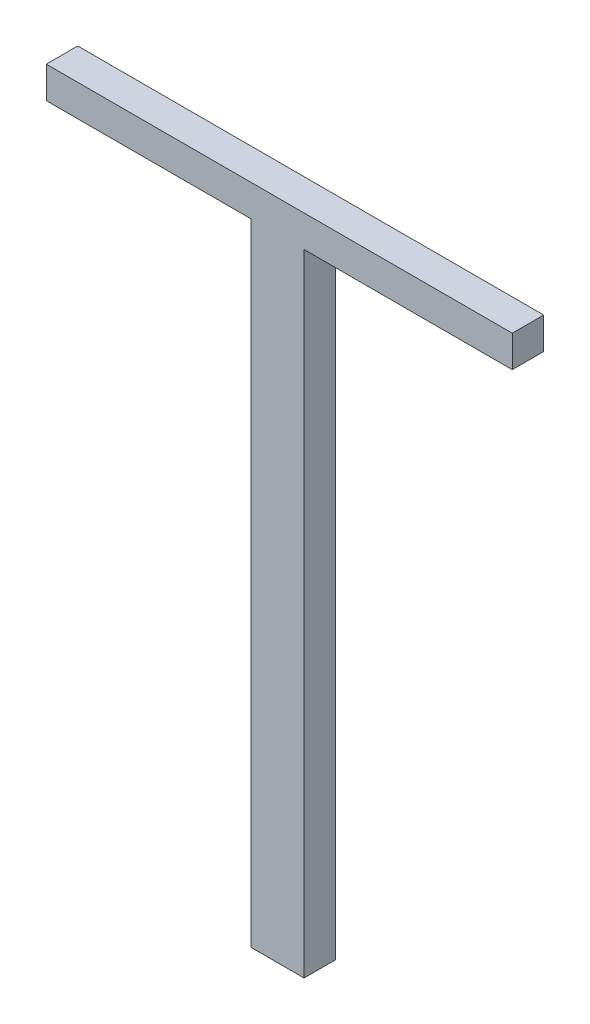
ISO-10303-21;
HEADER;
FILE_DESCRIPTION(('STEP AP214'),'2;1');
FILE_NAME('part.step','',(''),(''),'','','');
FILE_SCHEMA(('AUTOMOTIVE_DESIGN { 1 0 10303 214 1 1 1 1 }'));
ENDSEC;
DATA;
#1=APPLICATION_CONTEXT('core data for automotive mechanical design processes');
#2=APPLICATION_PROTOCOL_DEFINITION('international standard','automotive_design',2000,#1);
#3=PRODUCT_CONTEXT('',#1,'mechanical');
#4=PRODUCT('Part','Part','',(#3));
#5=PRODUCT_RELATED_PRODUCT_CATEGORY('part','',(#4));
#6=PRODUCT_DEFINITION_FORMATION('','',#4);
#7=PRODUCT_DEFINITION_CONTEXT('part definition',#1,'design');
#8=PRODUCT_DEFINITION('design','',#6,#7);
#9=PRODUCT_DEFINITION_SHAPE('','',#8);
#10=(LENGTH_UNIT() NAMED_UNIT(*) SI_UNIT(.MILLI.,.METRE.));
#11=(NAMED_UNIT(*) PLANE_ANGLE_UNIT() SI_UNIT($,.RADIAN.));
#12=(NAMED_UNIT(*) SI_UNIT($,.STERADIAN.) SOLID_ANGLE_UNIT());
#13=UNCERTAINTY_MEASURE_WITH_UNIT(LENGTH_MEASURE(1.E-05),#10,'distance_accuracy_value','');
#14=(GEOMETRIC_REPRESENTATION_CONTEXT(3) GLOBAL_UNCERTAINTY_ASSIGNED_CONTEXT((#13)) GLOBAL_UNIT_ASSIGNED_CONTEXT((#10,
#11,#12)) REPRESENTATION_CONTEXT('',''));
#15=CARTESIAN_POINT('',(0.,0.,0.));
#16=DIRECTION('',(0.,0.,1.));
#17=DIRECTION('',(1.,0.,0.));
#18=AXIS2_PLACEMENT_3D('',#15,#16,#17);
#19=CARTESIAN_POINT('',(58.0187075187695,-167.496729448971,50.));
#20=DIRECTION('',(0.,1.,0.));
#21=DIRECTION('',(0.,0.,1.));
#22=AXIS2_PLACEMENT_3D('',#19,#20,#21);
#23=PLANE('',#22);
#24=DIRECTION('',(1.,0.,0.));
#25=VECTOR('',#24,1.);
#26=CARTESIAN_POINT('',(58.0187075187695,-167.496729448971,0.));
#27=LINE('',#26,#25);
#28=CARTESIAN_POINT('',(-26.0359499678474,-167.496729448971,0.));
#29=VERTEX_POINT('',#28);
#30=CARTESIAN_POINT('',(58.0187075187695,-167.496729448971,0.));
#31=VERTEX_POINT('',#30);
#32=EDGE_CURVE('E131',#29,#31,#27,.T.);
#33=ORIENTED_EDGE('',*,*,#32,.T.);
#34=DIRECTION('',(0.,0.,-1.));
#35=VECTOR('',#34,1.);
#36=CARTESIAN_POINT('',(58.0187075187695,-167.496729448971,50.));
#37=LINE('',#36,#35);
#38=CARTESIAN_POINT('',(58.0187075187695,-167.496729448971,50.));
#39=VERTEX_POINT('',#38);
#40=EDGE_CURVE('E11',#39,#31,#37,.T.);
#41=ORIENTED_EDGE('',*,*,#40,.F.);
#42=DIRECTION('',(1.,0.,0.));
#43=VECTOR('',#42,1.);
#44=CARTESIAN_POINT('',(58.0187075187695,-167.496729448971,50.));
#45=LINE('',#44,#43);
#46=CARTESIAN_POINT('',(-26.0359499678474,-167.496729448971,50.));
#47=VERTEX_POINT('',#46);
#48=EDGE_CURVE('E145',#47,#39,#45,.T.);
#49=ORIENTED_EDGE('',*,*,#48,.F.);
#50=DIRECTION('',(0.,0.,-1.));
#51=VECTOR('',#50,1.);
#52=CARTESIAN_POINT('',(-26.0359499678474,-167.496729448971,50.));
#53=LINE('',#52,#51);
#54=EDGE_CURVE('E127',#47,#29,#53,.T.);
#55=ORIENTED_EDGE('',*,*,#54,.T.);
#56=EDGE_LOOP('',(#33,#41,#49,#55));
#57=FACE_BOUND('',#56,.T.);
#58=ADVANCED_FACE('F35',(#57),#23,.F.);
#59=CARTESIAN_POINT('',(58.0187075187695,835.72491726563,50.));
#60=DIRECTION('',(-1.,0.,0.));
#61=DIRECTION('',(0.,0.,1.));
#62=AXIS2_PLACEMENT_3D('',#59,#60,#61);
#63=PLANE('',#62);
#64=DIRECTION('',(0.,1.,0.));
#65=VECTOR('',#64,1.);
#66=CARTESIAN_POINT('',(58.0187075187695,835.72491726563,0.));
#67=LINE('',#66,#65);
#68=CARTESIAN_POINT('',(58.0187075187695,835.72491726563,0.));
#69=VERTEX_POINT('',#68);
#70=EDGE_CURVE('E134',#31,#69,#67,.T.);
#71=ORIENTED_EDGE('',*,*,#70,.T.);
#72=DIRECTION('',(0.,0.,-1.));
#73=VECTOR('',#72,1.);
#74=CARTESIAN_POINT('',(58.0187075187695,835.72491726563,50.));
#75=LINE('',#74,#73);
#76=CARTESIAN_POINT('',(58.0187075187695,835.72491726563,50.));
#77=VERTEX_POINT('',#76);
#78=EDGE_CURVE('E43',#77,#69,#75,.T.);
#79=ORIENTED_EDGE('',*,*,#78,.F.);
#80=DIRECTION('',(0.,1.,0.));
#81=VECTOR('',#80,1.);
#82=CARTESIAN_POINT('',(58.0187075187695,835.72491726563,50.));
#83=LINE('',#82,#81);
#84=EDGE_CURVE('E94',#39,#77,#83,.T.);
#85=ORIENTED_EDGE('',*,*,#84,.F.);
#86=ORIENTED_EDGE('',*,*,#40,.T.);
#87=EDGE_LOOP('',(#71,#79,#85,#86));
#88=FACE_BOUND('',#87,.T.);
#89=ADVANCED_FACE('F180',(#88),#63,.F.);
#90=CARTESIAN_POINT('',(389.114652518314,835.72491726563,50.));
#91=DIRECTION('',(0.,1.,0.));
#92=DIRECTION('',(0.,0.,1.));
#93=AXIS2_PLACEMENT_3D('',#90,#91,#92);
#94=PLANE('',#93);
#95=DIRECTION('',(1.,0.,0.));
#96=VECTOR('',#95,1.);
#97=CARTESIAN_POINT('',(389.114652518314,835.72491726563,0.));
#98=LINE('',#97,#96);
#99=CARTESIAN_POINT('',(389.114652518314,835.72491726563,0.));
#100=VERTEX_POINT('',#99);
#101=EDGE_CURVE('E136',#69,#100,#98,.T.);
#102=ORIENTED_EDGE('',*,*,#101,.T.);
#103=DIRECTION('',(0.,0.,-1.));
#104=VECTOR('',#103,1.);
#105=CARTESIAN_POINT('',(389.114652518314,835.72491726563,50.));
#106=LINE('',#105,#104);
#107=CARTESIAN_POINT('',(389.114652518314,835.72491726563,50.));
#108=VERTEX_POINT('',#107);
#109=EDGE_CURVE('E152',#108,#100,#106,.T.);
#110=ORIENTED_EDGE('',*,*,#109,.F.);
#111=DIRECTION('',(1.,0.,0.));
#112=VECTOR('',#111,1.);
#113=CARTESIAN_POINT('',(389.114652518314,835.72491726563,50.));
#114=LINE('',#113,#112);
#115=EDGE_CURVE('E160',#77,#108,#114,.T.);
#116=ORIENTED_EDGE('',*,*,#115,.F.);
#117=ORIENTED_EDGE('',*,*,#78,.T.);
#118=EDGE_LOOP('',(#102,#110,#116,#117));
#119=FACE_BOUND('',#118,.T.);
#120=ADVANCED_FACE('F158',(#119),#94,.F.);
#121=CARTESIAN_POINT('',(389.114652518314,886.007674206316,50.));
#122=DIRECTION('',(-1.,0.,0.));
#123=DIRECTION('',(0.,0.,1.));
#124=AXIS2_PLACEMENT_3D('',#121,#122,#123);
#125=PLANE('',#124);
#126=DIRECTION('',(0.,1.,0.));
#127=VECTOR('',#126,1.);
#128=CARTESIAN_POINT('',(389.114652518314,886.007674206316,0.));
#129=LINE('',#128,#127);
#130=CARTESIAN_POINT('',(389.114652518314,886.007674206316,0.));
#131=VERTEX_POINT('',#130);
#132=EDGE_CURVE('E138',#100,#131,#129,.T.);
#133=ORIENTED_EDGE('',*,*,#132,.T.);
#134=DIRECTION('',(0.,0.,-1.));
#135=VECTOR('',#134,1.);
#136=CARTESIAN_POINT('',(389.114652518314,886.007674206316,50.));
#137=LINE('',#136,#135);
#138=CARTESIAN_POINT('',(389.114652518314,886.007674206316,50.));
#139=VERTEX_POINT('',#138);
#140=EDGE_CURVE('E149',#139,#131,#137,.T.);
#141=ORIENTED_EDGE('',*,*,#140,.F.);
#142=DIRECTION('',(0.,1.,0.));
#143=VECTOR('',#142,1.);
#144=CARTESIAN_POINT('',(389.114652518314,886.007674206316,50.));
#145=LINE('',#144,#143);
#146=EDGE_CURVE('E172',#108,#139,#145,.T.);
#147=ORIENTED_EDGE('',*,*,#146,.F.);
#148=ORIENTED_EDGE('',*,*,#109,.T.);
#149=EDGE_LOOP('',(#133,#141,#147,#148));
#150=FACE_BOUND('',#149,.T.);
#151=ADVANCED_FACE('F168',(#150),#125,.F.);
#152=CARTESIAN_POINT('',(-351.793024616114,886.007674206316,50.));
#153=DIRECTION('',(0.,-1.,0.));
#154=DIRECTION('',(0.,0.,-1.));
#155=AXIS2_PLACEMENT_3D('',#152,#153,#154);
#156=PLANE('',#155);
#157=DIRECTION('',(-1.,0.,0.));
#158=VECTOR('',#157,1.);
#159=CARTESIAN_POINT('',(-351.793024616114,886.007674206316,0.));
#160=LINE('',#159,#158);
#161=CARTESIAN_POINT('',(-351.793024616114,886.007674206316,0.));
#162=VERTEX_POINT('',#161);
#163=EDGE_CURVE('E140',#131,#162,#160,.T.);
#164=ORIENTED_EDGE('',*,*,#163,.T.);
#165=DIRECTION('',(0.,0.,-1.));
#166=VECTOR('',#165,1.);
#167=CARTESIAN_POINT('',(-351.793024616114,886.007674206316,50.));
#168=LINE('',#167,#166);
#169=CARTESIAN_POINT('',(-351.793024616114,886.007674206316,50.));
#170=VERTEX_POINT('',#169);
#171=EDGE_CURVE('E122',#170,#162,#168,.T.);
#172=ORIENTED_EDGE('',*,*,#171,.F.);
#173=DIRECTION('',(-1.,0.,0.));
#174=VECTOR('',#173,1.);
#175=CARTESIAN_POINT('',(-351.793024616114,886.007674206316,50.));
#176=LINE('',#175,#174);
#177=EDGE_CURVE('E113',#139,#170,#176,.T.);
#178=ORIENTED_EDGE('',*,*,#177,.F.);
#179=ORIENTED_EDGE('',*,*,#140,.T.);
#180=EDGE_LOOP('',(#164,#172,#178,#179));
#181=FACE_BOUND('',#180,.T.);
#182=ADVANCED_FACE('F171',(#181),#156,.F.);
#183=CARTESIAN_POINT('',(-351.793024616114,835.72491726563,50.));
#184=DIRECTION('',(1.,0.,0.));
#185=DIRECTION('',(0.,0.,-1.));
#186=AXIS2_PLACEMENT_3D('',#183,#184,#185);
#187=PLANE('',#186);
#188=DIRECTION('',(0.,-1.,0.));
#189=VECTOR('',#188,1.);
#190=CARTESIAN_POINT('',(-351.793024616114,835.72491726563,0.));
#191=LINE('',#190,#189);
#192=CARTESIAN_POINT('',(-351.793024616114,835.72491726563,0.));
#193=VERTEX_POINT('',#192);
#194=EDGE_CURVE('E121',#162,#193,#191,.T.);
#195=ORIENTED_EDGE('',*,*,#194,.T.);
#196=DIRECTION('',(0.,0.,-1.));
#197=VECTOR('',#196,1.);
#198=CARTESIAN_POINT('',(-351.793024616114,835.72491726563,50.));
#199=LINE('',#198,#197);
#200=CARTESIAN_POINT('',(-351.793024616114,835.72491726563,50.));
#201=VERTEX_POINT('',#200);
#202=EDGE_CURVE('E118',#201,#193,#199,.T.);
#203=ORIENTED_EDGE('',*,*,#202,.F.);
#204=DIRECTION('',(0.,-1.,0.));
#205=VECTOR('',#204,1.);
#206=CARTESIAN_POINT('',(-351.793024616114,835.72491726563,50.));
#207=LINE('',#206,#205);
#208=EDGE_CURVE('E107',#170,#201,#207,.T.);
#209=ORIENTED_EDGE('',*,*,#208,.F.);
#210=ORIENTED_EDGE('',*,*,#171,.T.);
#211=EDGE_LOOP('',(#195,#203,#209,#210));
#212=FACE_BOUND('',#211,.T.);
#213=ADVANCED_FACE('F119',(#212),#187,.F.);
#214=CARTESIAN_POINT('',(-26.0359499678474,835.72491726563,50.));
#215=DIRECTION('',(0.,1.,0.));
#216=DIRECTION('',(0.,0.,1.));
#217=AXIS2_PLACEMENT_3D('',#214,#215,#216);
#218=PLANE('',#217);
#219=DIRECTION('',(1.,0.,0.));
#220=VECTOR('',#219,1.);
#221=CARTESIAN_POINT('',(-26.0359499678474,835.72491726563,0.));
#222=LINE('',#221,#220);
#223=CARTESIAN_POINT('',(-26.0359499678474,835.72491726563,0.));
#224=VERTEX_POINT('',#223);
#225=EDGE_CURVE('E80',#193,#224,#222,.T.);
#226=ORIENTED_EDGE('',*,*,#225,.T.);
#227=DIRECTION('',(0.,0.,-1.));
#228=VECTOR('',#227,1.);
#229=CARTESIAN_POINT('',(-26.0359499678474,835.72491726563,50.));
#230=LINE('',#229,#228);
#231=CARTESIAN_POINT('',(-26.0359499678474,835.72491726563,50.));
#232=VERTEX_POINT('',#231);
#233=EDGE_CURVE('E123',#232,#224,#230,.T.);
#234=ORIENTED_EDGE('',*,*,#233,.F.);
#235=DIRECTION('',(1.,0.,0.));
#236=VECTOR('',#235,1.);
#237=CARTESIAN_POINT('',(-26.0359499678474,835.72491726563,50.));
#238=LINE('',#237,#236);
#239=EDGE_CURVE('E111',#201,#232,#238,.T.);
#240=ORIENTED_EDGE('',*,*,#239,.F.);
#241=ORIENTED_EDGE('',*,*,#202,.T.);
#242=EDGE_LOOP('',(#226,#234,#240,#241));
#243=FACE_BOUND('',#242,.T.);
#244=ADVANCED_FACE('F125',(#243),#218,.F.);
#245=CARTESIAN_POINT('',(-26.0359499678474,-167.496729448971,50.));
#246=DIRECTION('',(1.,0.,0.));
#247=DIRECTION('',(0.,0.,-1.));
#248=AXIS2_PLACEMENT_3D('',#245,#246,#247);
#249=PLANE('',#248);
#250=DIRECTION('',(0.,-1.,0.));
#251=VECTOR('',#250,1.);
#252=CARTESIAN_POINT('',(-26.0359499678474,-167.496729448971,0.));
#253=LINE('',#252,#251);
#254=EDGE_CURVE('E86',#224,#29,#253,.T.);
#255=ORIENTED_EDGE('',*,*,#254,.T.);
#256=ORIENTED_EDGE('',*,*,#54,.F.);
#257=DIRECTION('',(0.,-1.,0.));
#258=VECTOR('',#257,1.);
#259=CARTESIAN_POINT('',(-26.0359499678474,-167.496729448971,50.));
#260=LINE('',#259,#258);
#261=EDGE_CURVE('E51',#232,#47,#260,.T.);
#262=ORIENTED_EDGE('',*,*,#261,.F.);
#263=ORIENTED_EDGE('',*,*,#233,.T.);
#264=EDGE_LOOP('',(#255,#256,#262,#263));
#265=FACE_BOUND('',#264,.T.);
#266=ADVANCED_FACE('F196',(#265),#249,.F.);
#267=CARTESIAN_POINT('',(0.,0.,50.));
#268=DIRECTION('',(0.,0.,-1.));
#269=DIRECTION('',(-1.,0.,0.));
#270=AXIS2_PLACEMENT_3D('',#267,#268,#269);
#271=PLANE('',#270);
#272=ORIENTED_EDGE('',*,*,#48,.T.);
#273=ORIENTED_EDGE('',*,*,#84,.T.);
#274=ORIENTED_EDGE('',*,*,#115,.T.);
#275=ORIENTED_EDGE('',*,*,#146,.T.);
#276=ORIENTED_EDGE('',*,*,#177,.T.);
#277=ORIENTED_EDGE('',*,*,#208,.T.);
#278=ORIENTED_EDGE('',*,*,#239,.T.);
#279=ORIENTED_EDGE('',*,*,#261,.T.);
#280=EDGE_LOOP('',(#272,#273,#274,#275,#276,#277,#278,#279));
#281=FACE_BOUND('',#280,.T.);
#282=ADVANCED_FACE('F109',(#281),#271,.F.);
#283=CARTESIAN_POINT('',(0.,0.,0.));
#284=DIRECTION('',(0.,0.,-1.));
#285=DIRECTION('',(-1.,0.,0.));
#286=AXIS2_PLACEMENT_3D('',#283,#284,#285);
#287=PLANE('',#286);
#288=ORIENTED_EDGE('',*,*,#32,.F.);
#289=ORIENTED_EDGE('',*,*,#254,.F.);
#290=ORIENTED_EDGE('',*,*,#225,.F.);
#291=ORIENTED_EDGE('',*,*,#194,.F.);
#292=ORIENTED_EDGE('',*,*,#163,.F.);
#293=ORIENTED_EDGE('',*,*,#132,.F.);
#294=ORIENTED_EDGE('',*,*,#101,.F.);
#295=ORIENTED_EDGE('',*,*,#70,.F.);
#296=EDGE_LOOP('',(#288,#289,#290,#291,#292,#293,#294,#295));
#297=FACE_BOUND('',#296,.T.);
#298=ADVANCED_FACE('F164',(#297),#287,.T.);
#299=CLOSED_SHELL('',(#58,#89,#120,#151,#182,#213,#244,#266,#282,#298));
#300=MANIFOLD_SOLID_BREP('B2',#299);
#301=ADVANCED_BREP_SHAPE_REPRESENTATION('',(#18,#300),#14);
#302=SHAPE_DEFINITION_REPRESENTATION(#9,#301);
ENDSEC;
END-ISO-10303-21;
